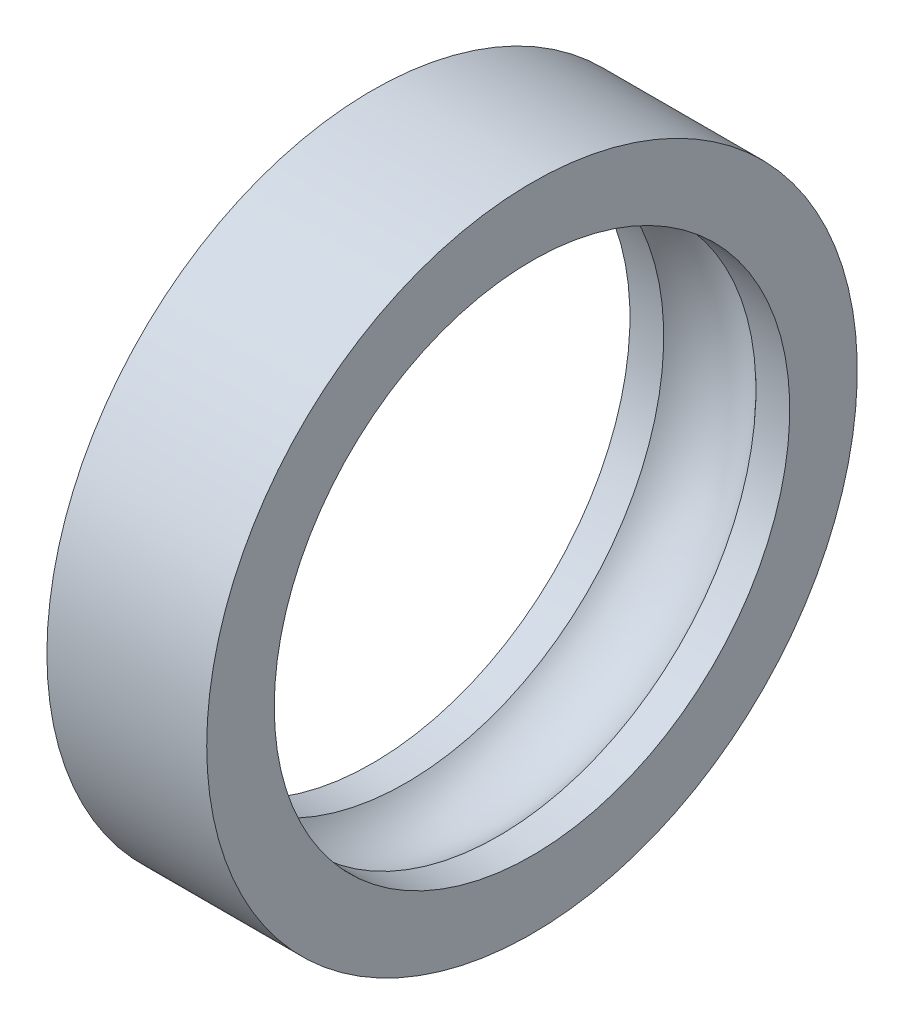
ISO-10303-21;
HEADER;
FILE_DESCRIPTION(('STEP AP214'),'2;1');
FILE_NAME('part.step','',(''),(''),'','','');
FILE_SCHEMA(('AUTOMOTIVE_DESIGN { 1 0 10303 214 1 1 1 1 }'));
ENDSEC;
DATA;
#1=APPLICATION_CONTEXT('core data for automotive mechanical design processes');
#2=APPLICATION_PROTOCOL_DEFINITION('international standard','automotive_design',2000,#1);
#3=PRODUCT_CONTEXT('',#1,'mechanical');
#4=PRODUCT('Part','Part','',(#3));
#5=PRODUCT_RELATED_PRODUCT_CATEGORY('part','',(#4));
#6=PRODUCT_DEFINITION_FORMATION('','',#4);
#7=PRODUCT_DEFINITION_CONTEXT('part definition',#1,'design');
#8=PRODUCT_DEFINITION('design','',#6,#7);
#9=PRODUCT_DEFINITION_SHAPE('','',#8);
#10=(LENGTH_UNIT() NAMED_UNIT(*) SI_UNIT(.MILLI.,.METRE.));
#11=(NAMED_UNIT(*) PLANE_ANGLE_UNIT() SI_UNIT($,.RADIAN.));
#12=(NAMED_UNIT(*) SI_UNIT($,.STERADIAN.) SOLID_ANGLE_UNIT());
#13=UNCERTAINTY_MEASURE_WITH_UNIT(LENGTH_MEASURE(1.E-05),#10,'distance_accuracy_value','');
#14=(GEOMETRIC_REPRESENTATION_CONTEXT(3) GLOBAL_UNCERTAINTY_ASSIGNED_CONTEXT((#13)) GLOBAL_UNIT_ASSIGNED_CONTEXT((#10,
#11,#12)) REPRESENTATION_CONTEXT('',''));
#15=CARTESIAN_POINT('',(0.,0.,0.));
#16=DIRECTION('',(0.,0.,1.));
#17=DIRECTION('',(1.,0.,0.));
#18=AXIS2_PLACEMENT_3D('',#15,#16,#17);
#19=CARTESIAN_POINT('',(8.94427190999916,0.,0.));
#20=DIRECTION('',(1.,0.,0.));
#21=DIRECTION('',(0.,0.,-1.));
#22=AXIS2_PLACEMENT_3D('',#19,#20,#21);
#23=CONICAL_SURFACE('',#22,50.,0.000186361283980244);
#24=CARTESIAN_POINT('',(15.5,0.,0.));
#25=DIRECTION('',(-1.,0.,0.));
#26=DIRECTION('',(0.,0.,1.));
#27=AXIS2_PLACEMENT_3D('',#24,#25,#26);
#28=CIRCLE('',#27,50.0012217339184);
#29=CARTESIAN_POINT('',(15.5,0.,50.0012217339184));
#30=VERTEX_POINT('',#29);
#31=EDGE_CURVE('E10',#30,#30,#28,.T.);
#32=ORIENTED_EDGE('',*,*,#31,.F.);
#33=EDGE_LOOP('',(#32));
#34=FACE_BOUND('',#33,.T.);
#35=CARTESIAN_POINT('',(8.94427190999916,0.,0.));
#36=DIRECTION('',(-1.,0.,0.));
#37=DIRECTION('',(0.,0.,1.));
#38=AXIS2_PLACEMENT_3D('',#35,#36,#37);
#39=CIRCLE('',#38,50.);
#40=CARTESIAN_POINT('',(8.94427190999916,0.,50.));
#41=VERTEX_POINT('',#40);
#42=EDGE_CURVE('E61',#41,#41,#39,.T.);
#43=ORIENTED_EDGE('',*,*,#42,.T.);
#44=EDGE_LOOP('',(#43));
#45=FACE_BOUND('',#44,.T.);
#46=ADVANCED_FACE('F39',(#34,#45),#23,.F.);
#47=CARTESIAN_POINT('',(15.5,63.1030927835051,0.));
#48=DIRECTION('',(-1.,0.,0.));
#49=DIRECTION('',(0.,0.,1.));
#50=AXIS2_PLACEMENT_3D('',#47,#48,#49);
#51=PLANE('',#50);
#52=CARTESIAN_POINT('',(15.5,0.,0.));
#53=DIRECTION('',(-1.,0.,0.));
#54=DIRECTION('',(0.,0.,1.));
#55=AXIS2_PLACEMENT_3D('',#52,#53,#54);
#56=CIRCLE('',#55,63.1030927835051);
#57=CARTESIAN_POINT('',(15.5,0.,63.1030927835051));
#58=VERTEX_POINT('',#57);
#59=EDGE_CURVE('E45',#58,#58,#56,.T.);
#60=ORIENTED_EDGE('',*,*,#59,.F.);
#61=EDGE_LOOP('',(#60));
#62=FACE_BOUND('',#61,.T.);
#63=ORIENTED_EDGE('',*,*,#31,.T.);
#64=EDGE_LOOP('',(#63));
#65=FACE_BOUND('',#64,.T.);
#66=ADVANCED_FACE('F86',(#62,#65),#51,.F.);
#67=CARTESIAN_POINT('',(-33.6365979381443,0.,0.));
#68=DIRECTION('',(-1.,0.,0.));
#69=DIRECTION('',(0.,0.,1.));
#70=AXIS2_PLACEMENT_3D('',#67,#68,#69);
#71=CYLINDRICAL_SURFACE('',#70,63.1030927835051);
#72=CARTESIAN_POINT('',(-15.5,0.,0.));
#73=DIRECTION('',(-1.,0.,0.));
#74=DIRECTION('',(0.,0.,1.));
#75=AXIS2_PLACEMENT_3D('',#72,#73,#74);
#76=CIRCLE('',#75,63.1030927835051);
#77=CARTESIAN_POINT('',(-15.5,0.,63.1030927835051));
#78=VERTEX_POINT('',#77);
#79=EDGE_CURVE('E49',#78,#78,#76,.T.);
#80=ORIENTED_EDGE('',*,*,#79,.F.);
#81=EDGE_LOOP('',(#80));
#82=FACE_BOUND('',#81,.T.);
#83=ORIENTED_EDGE('',*,*,#59,.T.);
#84=EDGE_LOOP('',(#83));
#85=FACE_BOUND('',#84,.T.);
#86=ADVANCED_FACE('F81',(#82,#85),#71,.T.);
#87=CARTESIAN_POINT('',(-15.5,63.1030927835051,0.));
#88=DIRECTION('',(1.,0.,0.));
#89=DIRECTION('',(0.,0.,-1.));
#90=AXIS2_PLACEMENT_3D('',#87,#88,#89);
#91=PLANE('',#90);
#92=CARTESIAN_POINT('',(-15.5,0.,0.));
#93=DIRECTION('',(-1.,0.,0.));
#94=DIRECTION('',(0.,0.,1.));
#95=AXIS2_PLACEMENT_3D('',#92,#93,#94);
#96=CIRCLE('',#95,50.);
#97=CARTESIAN_POINT('',(-15.5,0.,50.));
#98=VERTEX_POINT('',#97);
#99=EDGE_CURVE('E53',#98,#98,#96,.T.);
#100=ORIENTED_EDGE('',*,*,#99,.F.);
#101=EDGE_LOOP('',(#100));
#102=FACE_BOUND('',#101,.T.);
#103=ORIENTED_EDGE('',*,*,#79,.T.);
#104=EDGE_LOOP('',(#103));
#105=FACE_BOUND('',#104,.T.);
#106=ADVANCED_FACE('F75',(#102,#105),#91,.F.);
#107=CARTESIAN_POINT('',(-33.6365979381443,0.,0.));
#108=DIRECTION('',(-1.,0.,0.));
#109=DIRECTION('',(0.,0.,1.));
#110=AXIS2_PLACEMENT_3D('',#107,#108,#109);
#111=CYLINDRICAL_SURFACE('',#110,50.);
#112=CARTESIAN_POINT('',(-8.94427190999916,0.,0.));
#113=DIRECTION('',(-1.,0.,0.));
#114=DIRECTION('',(0.,0.,1.));
#115=AXIS2_PLACEMENT_3D('',#112,#113,#114);
#116=CIRCLE('',#115,50.);
#117=CARTESIAN_POINT('',(-8.94427190999916,0.,50.));
#118=VERTEX_POINT('',#117);
#119=EDGE_CURVE('E58',#118,#118,#116,.T.);
#120=ORIENTED_EDGE('',*,*,#119,.F.);
#121=EDGE_LOOP('',(#120));
#122=FACE_BOUND('',#121,.T.);
#123=ORIENTED_EDGE('',*,*,#99,.T.);
#124=EDGE_LOOP('',(#123));
#125=FACE_BOUND('',#124,.T.);
#126=ADVANCED_FACE('F69',(#122,#125),#111,.F.);
#127=CARTESIAN_POINT('',(0.,0.,0.));
#128=DIRECTION('',(-1.,0.,0.));
#129=DIRECTION('',(0.,0.,1.));
#130=AXIS2_PLACEMENT_3D('',#127,#128,#129);
#131=TOROIDAL_SURFACE('',#130,42.,12.);
#132=ORIENTED_EDGE('',*,*,#42,.F.);
#133=EDGE_LOOP('',(#132));
#134=FACE_BOUND('',#133,.T.);
#135=ORIENTED_EDGE('',*,*,#119,.T.);
#136=EDGE_LOOP('',(#135));
#137=FACE_BOUND('',#136,.T.);
#138=ADVANCED_FACE('F66',(#134,#137),#131,.F.);
#139=CLOSED_SHELL('',(#46,#66,#86,#106,#126,#138));
#140=MANIFOLD_SOLID_BREP('B2',#139);
#141=ADVANCED_BREP_SHAPE_REPRESENTATION('',(#18,#140),#14);
#142=SHAPE_DEFINITION_REPRESENTATION(#9,#141);
ENDSEC;
END-ISO-10303-21;
